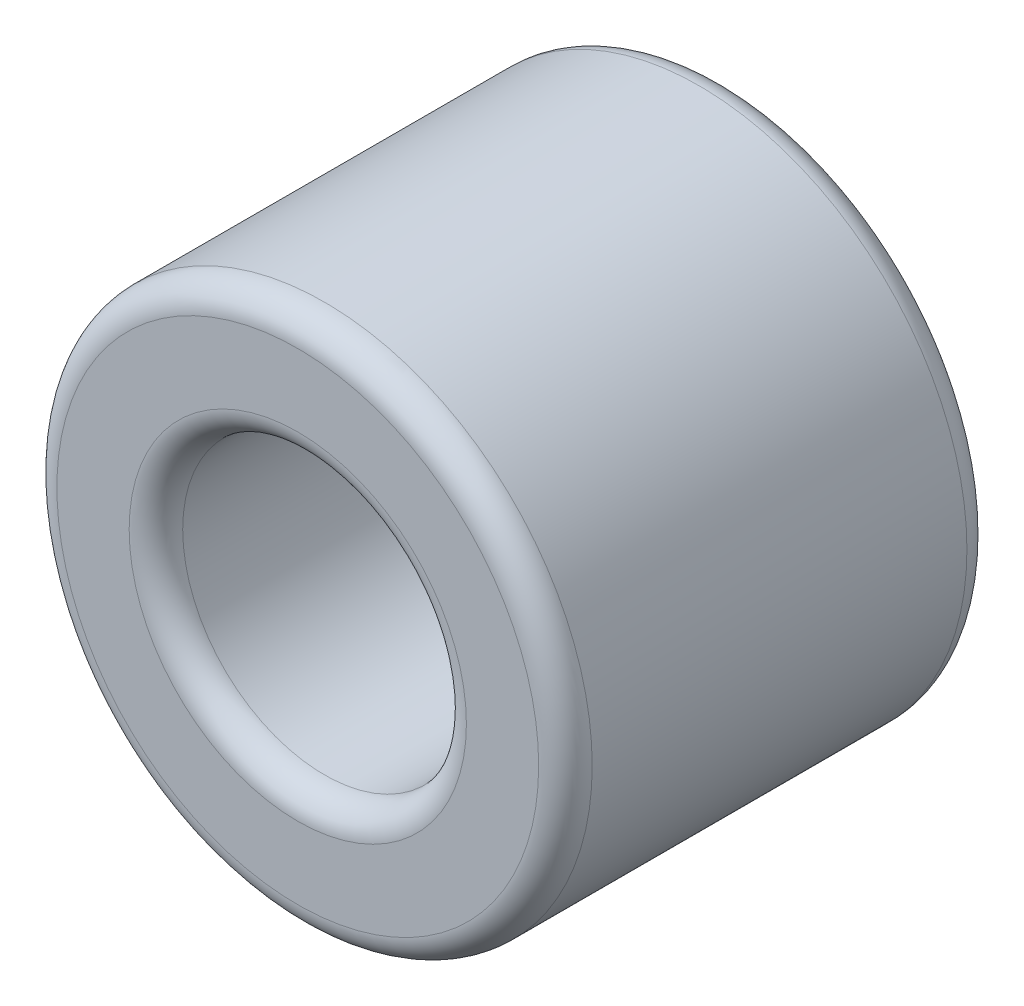
ISO-10303-21;
HEADER;
FILE_DESCRIPTION(('STEP AP214'),'2;1');
FILE_NAME('part.step','',(''),(''),'','','');
FILE_SCHEMA(('AUTOMOTIVE_DESIGN { 1 0 10303 214 1 1 1 1 }'));
ENDSEC;
DATA;
#1=APPLICATION_CONTEXT('core data for automotive mechanical design processes');
#2=APPLICATION_PROTOCOL_DEFINITION('international standard','automotive_design',2000,#1);
#3=PRODUCT_CONTEXT('',#1,'mechanical');
#4=PRODUCT('Part','Part','',(#3));
#5=PRODUCT_RELATED_PRODUCT_CATEGORY('part','',(#4));
#6=PRODUCT_DEFINITION_FORMATION('','',#4);
#7=PRODUCT_DEFINITION_CONTEXT('part definition',#1,'design');
#8=PRODUCT_DEFINITION('design','',#6,#7);
#9=PRODUCT_DEFINITION_SHAPE('','',#8);
#10=(LENGTH_UNIT() NAMED_UNIT(*) SI_UNIT(.MILLI.,.METRE.));
#11=(NAMED_UNIT(*) PLANE_ANGLE_UNIT() SI_UNIT($,.RADIAN.));
#12=(NAMED_UNIT(*) SI_UNIT($,.STERADIAN.) SOLID_ANGLE_UNIT());
#13=UNCERTAINTY_MEASURE_WITH_UNIT(LENGTH_MEASURE(1.E-05),#10,'distance_accuracy_value','');
#14=(GEOMETRIC_REPRESENTATION_CONTEXT(3) GLOBAL_UNCERTAINTY_ASSIGNED_CONTEXT((#13)) GLOBAL_UNIT_ASSIGNED_CONTEXT((#10,
#11,#12)) REPRESENTATION_CONTEXT('',''));
#15=CARTESIAN_POINT('',(0.,0.,0.));
#16=DIRECTION('',(0.,0.,1.));
#17=DIRECTION('',(1.,0.,0.));
#18=AXIS2_PLACEMENT_3D('',#15,#16,#17);
#19=CARTESIAN_POINT('',(0.,0.,8.));
#20=DIRECTION('',(0.,0.,1.));
#21=DIRECTION('',(1.,0.,0.));
#22=AXIS2_PLACEMENT_3D('',#19,#20,#21);
#23=PLANE('',#22);
#24=CARTESIAN_POINT('',(0.,0.,8.));
#25=DIRECTION('',(0.,0.,1.));
#26=DIRECTION('',(1.,0.,0.));
#27=AXIS2_PLACEMENT_3D('',#24,#25,#26);
#28=CIRCLE('',#27,3.15000000000004);
#29=CARTESIAN_POINT('',(3.15000000000004,0.,8.));
#30=VERTEX_POINT('',#29);
#31=EDGE_CURVE('E56',#30,#30,#28,.F.);
#32=ORIENTED_EDGE('',*,*,#31,.T.);
#33=EDGE_LOOP('',(#32));
#34=FACE_BOUND('',#33,.T.);
#35=CARTESIAN_POINT('',(0.,0.,8.));
#36=DIRECTION('',(0.,0.,1.));
#37=DIRECTION('',(1.,0.,0.));
#38=AXIS2_PLACEMENT_3D('',#35,#36,#37);
#39=CIRCLE('',#38,4.49999999999989);
#40=CARTESIAN_POINT('',(4.49999999999989,0.,8.));
#41=VERTEX_POINT('',#40);
#42=EDGE_CURVE('E61',#41,#41,#39,.T.);
#43=ORIENTED_EDGE('',*,*,#42,.T.);
#44=EDGE_LOOP('',(#43));
#45=FACE_BOUND('',#44,.T.);
#46=ADVANCED_FACE('F43',(#34,#45),#23,.T.);
#47=CARTESIAN_POINT('',(0.,0.,0.));
#48=DIRECTION('',(0.,0.,1.));
#49=DIRECTION('',(1.,0.,0.));
#50=AXIS2_PLACEMENT_3D('',#47,#48,#49);
#51=PLANE('',#50);
#52=CARTESIAN_POINT('',(0.,0.,0.));
#53=DIRECTION('',(0.,0.,1.));
#54=DIRECTION('',(1.,0.,0.));
#55=AXIS2_PLACEMENT_3D('',#52,#53,#54);
#56=CIRCLE('',#55,3.15000000000004);
#57=CARTESIAN_POINT('',(3.15000000000004,0.,0.));
#58=VERTEX_POINT('',#57);
#59=EDGE_CURVE('E75',#58,#58,#56,.T.);
#60=ORIENTED_EDGE('',*,*,#59,.T.);
#61=EDGE_LOOP('',(#60));
#62=FACE_BOUND('',#61,.T.);
#63=CARTESIAN_POINT('',(0.,0.,0.));
#64=DIRECTION('',(0.,0.,1.));
#65=DIRECTION('',(1.,0.,0.));
#66=AXIS2_PLACEMENT_3D('',#63,#64,#65);
#67=CIRCLE('',#66,4.49999999999989);
#68=CARTESIAN_POINT('',(4.49999999999989,0.,0.));
#69=VERTEX_POINT('',#68);
#70=EDGE_CURVE('E79',#69,#69,#67,.F.);
#71=ORIENTED_EDGE('',*,*,#70,.T.);
#72=EDGE_LOOP('',(#71));
#73=FACE_BOUND('',#72,.T.);
#74=ADVANCED_FACE('F84',(#62,#73),#51,.F.);
#75=CARTESIAN_POINT('',(0.,0.,8.));
#76=DIRECTION('',(0.,0.,-1.));
#77=DIRECTION('',(-1.,0.,0.));
#78=AXIS2_PLACEMENT_3D('',#75,#76,#77);
#79=CYLINDRICAL_SURFACE('',#78,4.99999999999989);
#80=CARTESIAN_POINT('',(0.,0.,0.5));
#81=DIRECTION('',(0.,0.,1.));
#82=DIRECTION('',(1.,0.,0.));
#83=AXIS2_PLACEMENT_3D('',#80,#81,#82);
#84=CIRCLE('',#83,4.99999999999989);
#85=CARTESIAN_POINT('',(4.99999999999989,0.,0.5));
#86=VERTEX_POINT('',#85);
#87=EDGE_CURVE('E10',#86,#86,#84,.T.);
#88=ORIENTED_EDGE('',*,*,#87,.T.);
#89=EDGE_LOOP('',(#88));
#90=FACE_BOUND('',#89,.T.);
#91=CARTESIAN_POINT('',(0.,0.,7.5));
#92=DIRECTION('',(0.,0.,1.));
#93=DIRECTION('',(1.,0.,0.));
#94=AXIS2_PLACEMENT_3D('',#91,#92,#93);
#95=CIRCLE('',#94,4.99999999999989);
#96=CARTESIAN_POINT('',(4.99999999999989,0.,7.5));
#97=VERTEX_POINT('',#96);
#98=EDGE_CURVE('E51',#97,#97,#95,.F.);
#99=ORIENTED_EDGE('',*,*,#98,.T.);
#100=EDGE_LOOP('',(#99));
#101=FACE_BOUND('',#100,.T.);
#102=ADVANCED_FACE('F104',(#90,#101),#79,.T.);
#103=CARTESIAN_POINT('',(0.,0.,8.));
#104=DIRECTION('',(0.,0.,-1.));
#105=DIRECTION('',(-1.,0.,0.));
#106=AXIS2_PLACEMENT_3D('',#103,#104,#105);
#107=CYLINDRICAL_SURFACE('',#106,2.65000000000004);
#108=CARTESIAN_POINT('',(0.,0.,0.5));
#109=DIRECTION('',(0.,0.,1.));
#110=DIRECTION('',(1.,0.,0.));
#111=AXIS2_PLACEMENT_3D('',#108,#109,#110);
#112=CIRCLE('',#111,2.65000000000004);
#113=CARTESIAN_POINT('',(2.65000000000004,0.,0.5));
#114=VERTEX_POINT('',#113);
#115=EDGE_CURVE('E67',#114,#114,#112,.F.);
#116=ORIENTED_EDGE('',*,*,#115,.T.);
#117=EDGE_LOOP('',(#116));
#118=FACE_BOUND('',#117,.T.);
#119=CARTESIAN_POINT('',(0.,0.,7.5));
#120=DIRECTION('',(0.,0.,1.));
#121=DIRECTION('',(1.,0.,0.));
#122=AXIS2_PLACEMENT_3D('',#119,#120,#121);
#123=CIRCLE('',#122,2.65000000000004);
#124=CARTESIAN_POINT('',(2.65000000000004,0.,7.5));
#125=VERTEX_POINT('',#124);
#126=EDGE_CURVE('E71',#125,#125,#123,.T.);
#127=ORIENTED_EDGE('',*,*,#126,.T.);
#128=EDGE_LOOP('',(#127));
#129=FACE_BOUND('',#128,.T.);
#130=ADVANCED_FACE('F109',(#118,#129),#107,.F.);
#131=CARTESIAN_POINT('',(0.,0.,0.5));
#132=DIRECTION('',(0.,0.,1.));
#133=DIRECTION('',(1.,0.,0.));
#134=AXIS2_PLACEMENT_3D('',#131,#132,#133);
#135=TOROIDAL_SURFACE('',#134,3.15000000000004,0.5);
#136=ORIENTED_EDGE('',*,*,#115,.F.);
#137=EDGE_LOOP('',(#136));
#138=FACE_BOUND('',#137,.T.);
#139=ORIENTED_EDGE('',*,*,#59,.F.);
#140=EDGE_LOOP('',(#139));
#141=FACE_BOUND('',#140,.T.);
#142=ADVANCED_FACE('F95',(#138,#141),#135,.T.);
#143=CARTESIAN_POINT('',(0.,0.,7.5));
#144=DIRECTION('',(0.,0.,1.));
#145=DIRECTION('',(1.,0.,0.));
#146=AXIS2_PLACEMENT_3D('',#143,#144,#145);
#147=TOROIDAL_SURFACE('',#146,3.15000000000004,0.5);
#148=ORIENTED_EDGE('',*,*,#31,.F.);
#149=EDGE_LOOP('',(#148));
#150=FACE_BOUND('',#149,.T.);
#151=ORIENTED_EDGE('',*,*,#126,.F.);
#152=EDGE_LOOP('',(#151));
#153=FACE_BOUND('',#152,.T.);
#154=ADVANCED_FACE('F89',(#150,#153),#147,.T.);
#155=CARTESIAN_POINT('',(0.,0.,0.5));
#156=DIRECTION('',(0.,0.,1.));
#157=DIRECTION('',(1.,0.,0.));
#158=AXIS2_PLACEMENT_3D('',#155,#156,#157);
#159=TOROIDAL_SURFACE('',#158,4.49999999999989,0.5);
#160=ORIENTED_EDGE('',*,*,#70,.F.);
#161=EDGE_LOOP('',(#160));
#162=FACE_BOUND('',#161,.T.);
#163=ORIENTED_EDGE('',*,*,#87,.F.);
#164=EDGE_LOOP('',(#163));
#165=FACE_BOUND('',#164,.T.);
#166=ADVANCED_FACE('F86',(#162,#165),#159,.T.);
#167=CARTESIAN_POINT('',(0.,0.,7.5));
#168=DIRECTION('',(0.,0.,1.));
#169=DIRECTION('',(1.,0.,0.));
#170=AXIS2_PLACEMENT_3D('',#167,#168,#169);
#171=TOROIDAL_SURFACE('',#170,4.49999999999989,0.5);
#172=ORIENTED_EDGE('',*,*,#98,.F.);
#173=EDGE_LOOP('',(#172));
#174=FACE_BOUND('',#173,.T.);
#175=ORIENTED_EDGE('',*,*,#42,.F.);
#176=EDGE_LOOP('',(#175));
#177=FACE_BOUND('',#176,.T.);
#178=ADVANCED_FACE('F45',(#174,#177),#171,.T.);
#179=CLOSED_SHELL('',(#46,#74,#102,#130,#142,#154,#166,#178));
#180=MANIFOLD_SOLID_BREP('B2',#179);
#181=ADVANCED_BREP_SHAPE_REPRESENTATION('',(#18,#180),#14);
#182=SHAPE_DEFINITION_REPRESENTATION(#9,#181);
ENDSEC;
END-ISO-10303-21;
